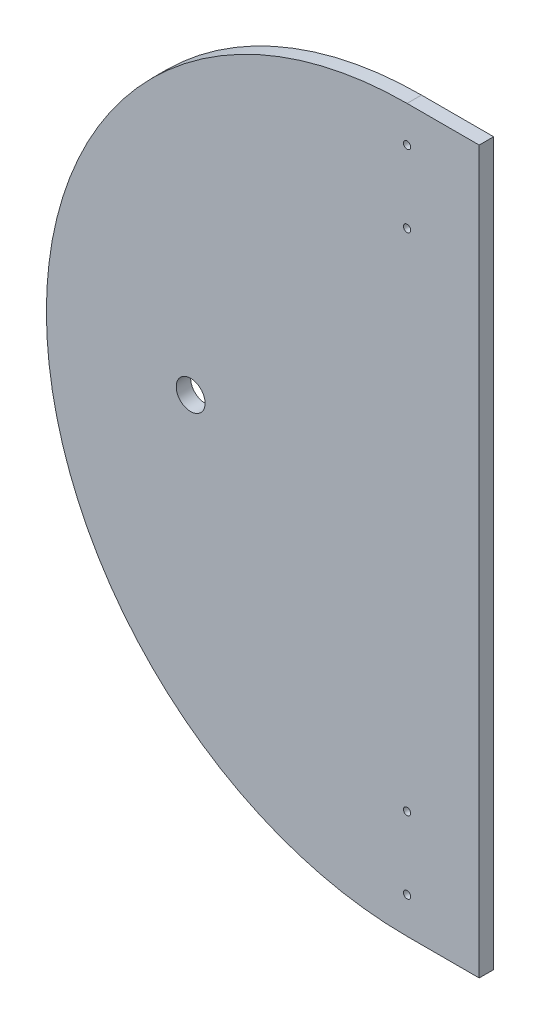
ISO-10303-21;
HEADER;
FILE_DESCRIPTION(('STEP AP214'),'2;1');
FILE_NAME('part.step','',(''),(''),'','','');
FILE_SCHEMA(('AUTOMOTIVE_DESIGN { 1 0 10303 214 1 1 1 1 }'));
ENDSEC;
DATA;
#1=APPLICATION_CONTEXT('core data for automotive mechanical design processes');
#2=APPLICATION_PROTOCOL_DEFINITION('international standard','automotive_design',2000,#1);
#3=PRODUCT_CONTEXT('',#1,'mechanical');
#4=PRODUCT('Part','Part','',(#3));
#5=PRODUCT_RELATED_PRODUCT_CATEGORY('part','',(#4));
#6=PRODUCT_DEFINITION_FORMATION('','',#4);
#7=PRODUCT_DEFINITION_CONTEXT('part definition',#1,'design');
#8=PRODUCT_DEFINITION('design','',#6,#7);
#9=PRODUCT_DEFINITION_SHAPE('','',#8);
#10=(LENGTH_UNIT() NAMED_UNIT(*) SI_UNIT(.MILLI.,.METRE.));
#11=(NAMED_UNIT(*) PLANE_ANGLE_UNIT() SI_UNIT($,.RADIAN.));
#12=(NAMED_UNIT(*) SI_UNIT($,.STERADIAN.) SOLID_ANGLE_UNIT());
#13=UNCERTAINTY_MEASURE_WITH_UNIT(LENGTH_MEASURE(1.E-05),#10,'distance_accuracy_value','');
#14=(GEOMETRIC_REPRESENTATION_CONTEXT(3) GLOBAL_UNCERTAINTY_ASSIGNED_CONTEXT((#13)) GLOBAL_UNIT_ASSIGNED_CONTEXT((#10,
#11,#12)) REPRESENTATION_CONTEXT('',''));
#15=CARTESIAN_POINT('',(0.,0.,0.));
#16=DIRECTION('',(0.,0.,1.));
#17=DIRECTION('',(1.,0.,0.));
#18=AXIS2_PLACEMENT_3D('',#15,#16,#17);
#19=CARTESIAN_POINT('',(0.,0.,5.));
#20=DIRECTION('',(0.,0.,1.));
#21=DIRECTION('',(1.,0.,0.));
#22=AXIS2_PLACEMENT_3D('',#19,#20,#21);
#23=PLANE('',#22);
#24=CARTESIAN_POINT('',(0.,-112.5,5.));
#25=DIRECTION('',(0.,0.,1.));
#26=DIRECTION('',(-1.,0.,0.));
#27=AXIS2_PLACEMENT_3D('',#24,#25,#26);
#28=CIRCLE('',#27,1.25);
#29=CARTESIAN_POINT('',(-1.25,-112.5,5.));
#30=VERTEX_POINT('',#29);
#31=EDGE_CURVE('E135',#30,#30,#28,.T.);
#32=ORIENTED_EDGE('',*,*,#31,.F.);
#33=EDGE_LOOP('',(#32));
#34=FACE_BOUND('',#33,.T.);
#35=CARTESIAN_POINT('',(0.,87.5,5.));
#36=DIRECTION('',(0.,0.,1.));
#37=DIRECTION('',(1.,0.,0.));
#38=AXIS2_PLACEMENT_3D('',#35,#36,#37);
#39=CIRCLE('',#38,1.25);
#40=CARTESIAN_POINT('',(1.25,87.5,5.));
#41=VERTEX_POINT('',#40);
#42=EDGE_CURVE('E123',#41,#41,#39,.T.);
#43=ORIENTED_EDGE('',*,*,#42,.F.);
#44=EDGE_LOOP('',(#43));
#45=FACE_BOUND('',#44,.T.);
#46=DIRECTION('',(0.,1.,0.));
#47=VECTOR('',#46,1.);
#48=CARTESIAN_POINT('',(25.,125.,5.));
#49=LINE('',#48,#47);
#50=CARTESIAN_POINT('',(25.,-125.,5.));
#51=VERTEX_POINT('',#50);
#52=CARTESIAN_POINT('',(25.,125.,5.));
#53=VERTEX_POINT('',#52);
#54=EDGE_CURVE('E93',#51,#53,#49,.T.);
#55=ORIENTED_EDGE('',*,*,#54,.T.);
#56=DIRECTION('',(-1.,0.,0.));
#57=VECTOR('',#56,1.);
#58=CARTESIAN_POINT('',(0.,125.,5.));
#59=LINE('',#58,#57);
#60=CARTESIAN_POINT('',(0.,125.,5.));
#61=VERTEX_POINT('',#60);
#62=EDGE_CURVE('E88',#53,#61,#59,.T.);
#63=ORIENTED_EDGE('',*,*,#62,.T.);
#64=CARTESIAN_POINT('',(0.,0.,5.));
#65=DIRECTION('',(0.,0.,1.));
#66=DIRECTION('',(1.,0.,0.));
#67=AXIS2_PLACEMENT_3D('',#64,#65,#66);
#68=CIRCLE('',#67,125.);
#69=CARTESIAN_POINT('',(0.,-125.,5.));
#70=VERTEX_POINT('',#69);
#71=EDGE_CURVE('E91',#61,#70,#68,.T.);
#72=ORIENTED_EDGE('',*,*,#71,.T.);
#73=DIRECTION('',(1.,0.,0.));
#74=VECTOR('',#73,1.);
#75=CARTESIAN_POINT('',(25.,-125.,5.));
#76=LINE('',#75,#74);
#77=EDGE_CURVE('E58',#70,#51,#76,.T.);
#78=ORIENTED_EDGE('',*,*,#77,.T.);
#79=EDGE_LOOP('',(#55,#63,#72,#78));
#80=FACE_BOUND('',#79,.T.);
#81=CARTESIAN_POINT('',(0.,112.5,5.));
#82=DIRECTION('',(0.,0.,1.));
#83=DIRECTION('',(1.,0.,0.));
#84=AXIS2_PLACEMENT_3D('',#81,#82,#83);
#85=CIRCLE('',#84,1.25);
#86=CARTESIAN_POINT('',(1.25,112.5,5.));
#87=VERTEX_POINT('',#86);
#88=EDGE_CURVE('E108',#87,#87,#85,.T.);
#89=ORIENTED_EDGE('',*,*,#88,.F.);
#90=EDGE_LOOP('',(#89));
#91=FACE_BOUND('',#90,.T.);
#92=CARTESIAN_POINT('',(0.,-87.5,5.));
#93=DIRECTION('',(0.,0.,1.));
#94=DIRECTION('',(-1.,0.,0.));
#95=AXIS2_PLACEMENT_3D('',#92,#93,#94);
#96=CIRCLE('',#95,1.25);
#97=CARTESIAN_POINT('',(-1.25,-87.5,5.));
#98=VERTEX_POINT('',#97);
#99=EDGE_CURVE('E129',#98,#98,#96,.T.);
#100=ORIENTED_EDGE('',*,*,#99,.F.);
#101=EDGE_LOOP('',(#100));
#102=FACE_BOUND('',#101,.T.);
#103=CARTESIAN_POINT('',(-75.,0.,5.));
#104=DIRECTION('',(0.,0.,1.));
#105=DIRECTION('',(1.,0.,0.));
#106=AXIS2_PLACEMENT_3D('',#103,#104,#105);
#107=CIRCLE('',#106,5.);
#108=CARTESIAN_POINT('',(-70.,0.,5.));
#109=VERTEX_POINT('',#108);
#110=EDGE_CURVE('E141',#109,#109,#107,.T.);
#111=ORIENTED_EDGE('',*,*,#110,.F.);
#112=EDGE_LOOP('',(#111));
#113=FACE_BOUND('',#112,.T.);
#114=ADVANCED_FACE('F41',(#34,#45,#80,#91,#102,#113),#23,.T.);
#115=CARTESIAN_POINT('',(0.,0.,0.));
#116=DIRECTION('',(0.,0.,1.));
#117=DIRECTION('',(1.,0.,0.));
#118=AXIS2_PLACEMENT_3D('',#115,#116,#117);
#119=PLANE('',#118);
#120=DIRECTION('',(0.,1.,0.));
#121=VECTOR('',#120,1.);
#122=CARTESIAN_POINT('',(25.,125.,0.));
#123=LINE('',#122,#121);
#124=CARTESIAN_POINT('',(25.,-125.,0.));
#125=VERTEX_POINT('',#124);
#126=CARTESIAN_POINT('',(25.,125.,0.));
#127=VERTEX_POINT('',#126);
#128=EDGE_CURVE('E105',#125,#127,#123,.T.);
#129=ORIENTED_EDGE('',*,*,#128,.F.);
#130=DIRECTION('',(1.,0.,0.));
#131=VECTOR('',#130,1.);
#132=CARTESIAN_POINT('',(25.,-125.,0.));
#133=LINE('',#132,#131);
#134=CARTESIAN_POINT('',(0.,-125.,0.));
#135=VERTEX_POINT('',#134);
#136=EDGE_CURVE('E81',#135,#125,#133,.T.);
#137=ORIENTED_EDGE('',*,*,#136,.F.);
#138=CARTESIAN_POINT('',(0.,0.,0.));
#139=DIRECTION('',(0.,0.,1.));
#140=DIRECTION('',(1.,0.,0.));
#141=AXIS2_PLACEMENT_3D('',#138,#139,#140);
#142=CIRCLE('',#141,125.);
#143=CARTESIAN_POINT('',(0.,125.,0.));
#144=VERTEX_POINT('',#143);
#145=EDGE_CURVE('E75',#144,#135,#142,.T.);
#146=ORIENTED_EDGE('',*,*,#145,.F.);
#147=DIRECTION('',(-1.,0.,0.));
#148=VECTOR('',#147,1.);
#149=CARTESIAN_POINT('',(0.,125.,0.));
#150=LINE('',#149,#148);
#151=EDGE_CURVE('E97',#127,#144,#150,.T.);
#152=ORIENTED_EDGE('',*,*,#151,.F.);
#153=EDGE_LOOP('',(#129,#137,#146,#152));
#154=FACE_BOUND('',#153,.T.);
#155=CARTESIAN_POINT('',(0.,112.5,0.));
#156=DIRECTION('',(0.,0.,1.));
#157=DIRECTION('',(1.,0.,0.));
#158=AXIS2_PLACEMENT_3D('',#155,#156,#157);
#159=CIRCLE('',#158,1.25);
#160=CARTESIAN_POINT('',(1.25,112.5,0.));
#161=VERTEX_POINT('',#160);
#162=EDGE_CURVE('E120',#161,#161,#159,.T.);
#163=ORIENTED_EDGE('',*,*,#162,.T.);
#164=EDGE_LOOP('',(#163));
#165=FACE_BOUND('',#164,.T.);
#166=CARTESIAN_POINT('',(0.,87.5,0.));
#167=DIRECTION('',(0.,0.,1.));
#168=DIRECTION('',(1.,0.,0.));
#169=AXIS2_PLACEMENT_3D('',#166,#167,#168);
#170=CIRCLE('',#169,1.25);
#171=CARTESIAN_POINT('',(1.25,87.5,0.));
#172=VERTEX_POINT('',#171);
#173=EDGE_CURVE('E126',#172,#172,#170,.T.);
#174=ORIENTED_EDGE('',*,*,#173,.T.);
#175=EDGE_LOOP('',(#174));
#176=FACE_BOUND('',#175,.T.);
#177=CARTESIAN_POINT('',(0.,-87.5,0.));
#178=DIRECTION('',(0.,0.,1.));
#179=DIRECTION('',(-1.,0.,0.));
#180=AXIS2_PLACEMENT_3D('',#177,#178,#179);
#181=CIRCLE('',#180,1.25);
#182=CARTESIAN_POINT('',(-1.25,-87.5,0.));
#183=VERTEX_POINT('',#182);
#184=EDGE_CURVE('E132',#183,#183,#181,.T.);
#185=ORIENTED_EDGE('',*,*,#184,.T.);
#186=EDGE_LOOP('',(#185));
#187=FACE_BOUND('',#186,.T.);
#188=CARTESIAN_POINT('',(0.,-112.5,0.));
#189=DIRECTION('',(0.,0.,1.));
#190=DIRECTION('',(-1.,0.,0.));
#191=AXIS2_PLACEMENT_3D('',#188,#189,#190);
#192=CIRCLE('',#191,1.25);
#193=CARTESIAN_POINT('',(-1.25,-112.5,0.));
#194=VERTEX_POINT('',#193);
#195=EDGE_CURVE('E138',#194,#194,#192,.T.);
#196=ORIENTED_EDGE('',*,*,#195,.T.);
#197=EDGE_LOOP('',(#196));
#198=FACE_BOUND('',#197,.T.);
#199=CARTESIAN_POINT('',(-75.,0.,0.));
#200=DIRECTION('',(0.,0.,1.));
#201=DIRECTION('',(1.,0.,0.));
#202=AXIS2_PLACEMENT_3D('',#199,#200,#201);
#203=CIRCLE('',#202,5.);
#204=CARTESIAN_POINT('',(-70.,0.,0.));
#205=VERTEX_POINT('',#204);
#206=EDGE_CURVE('E144',#205,#205,#203,.T.);
#207=ORIENTED_EDGE('',*,*,#206,.T.);
#208=EDGE_LOOP('',(#207));
#209=FACE_BOUND('',#208,.T.);
#210=ADVANCED_FACE('F116',(#154,#165,#176,#187,#198,#209),#119,.F.);
#211=CARTESIAN_POINT('',(25.,125.,5.));
#212=DIRECTION('',(-1.,0.,0.));
#213=DIRECTION('',(0.,0.,1.));
#214=AXIS2_PLACEMENT_3D('',#211,#212,#213);
#215=PLANE('',#214);
#216=ORIENTED_EDGE('',*,*,#128,.T.);
#217=DIRECTION('',(0.,0.,-1.));
#218=VECTOR('',#217,1.);
#219=CARTESIAN_POINT('',(25.,125.,5.));
#220=LINE('',#219,#218);
#221=EDGE_CURVE('E11',#53,#127,#220,.T.);
#222=ORIENTED_EDGE('',*,*,#221,.F.);
#223=ORIENTED_EDGE('',*,*,#54,.F.);
#224=DIRECTION('',(0.,0.,-1.));
#225=VECTOR('',#224,1.);
#226=CARTESIAN_POINT('',(25.,-125.,5.));
#227=LINE('',#226,#225);
#228=EDGE_CURVE('E101',#51,#125,#227,.T.);
#229=ORIENTED_EDGE('',*,*,#228,.T.);
#230=EDGE_LOOP('',(#216,#222,#223,#229));
#231=FACE_BOUND('',#230,.T.);
#232=ADVANCED_FACE('F43',(#231),#215,.F.);
#233=CARTESIAN_POINT('',(0.,125.,5.));
#234=DIRECTION('',(0.,-1.,0.));
#235=DIRECTION('',(0.,0.,-1.));
#236=AXIS2_PLACEMENT_3D('',#233,#234,#235);
#237=PLANE('',#236);
#238=ORIENTED_EDGE('',*,*,#151,.T.);
#239=DIRECTION('',(0.,0.,-1.));
#240=VECTOR('',#239,1.);
#241=CARTESIAN_POINT('',(0.,125.,5.));
#242=LINE('',#241,#240);
#243=EDGE_CURVE('E50',#61,#144,#242,.T.);
#244=ORIENTED_EDGE('',*,*,#243,.F.);
#245=ORIENTED_EDGE('',*,*,#62,.F.);
#246=ORIENTED_EDGE('',*,*,#221,.T.);
#247=EDGE_LOOP('',(#238,#244,#245,#246));
#248=FACE_BOUND('',#247,.T.);
#249=ADVANCED_FACE('F96',(#248),#237,.F.);
#250=CARTESIAN_POINT('',(0.,0.,5.));
#251=DIRECTION('',(0.,0.,-1.));
#252=DIRECTION('',(-1.,0.,0.));
#253=AXIS2_PLACEMENT_3D('',#250,#251,#252);
#254=CYLINDRICAL_SURFACE('',#253,125.);
#255=ORIENTED_EDGE('',*,*,#145,.T.);
#256=DIRECTION('',(0.,0.,-1.));
#257=VECTOR('',#256,1.);
#258=CARTESIAN_POINT('',(0.,-125.,5.));
#259=LINE('',#258,#257);
#260=EDGE_CURVE('E98',#70,#135,#259,.T.);
#261=ORIENTED_EDGE('',*,*,#260,.F.);
#262=ORIENTED_EDGE('',*,*,#71,.F.);
#263=ORIENTED_EDGE('',*,*,#243,.T.);
#264=EDGE_LOOP('',(#255,#261,#262,#263));
#265=FACE_BOUND('',#264,.T.);
#266=ADVANCED_FACE('F99',(#265),#254,.T.);
#267=CARTESIAN_POINT('',(25.,-125.,5.));
#268=DIRECTION('',(0.,1.,0.));
#269=DIRECTION('',(0.,0.,1.));
#270=AXIS2_PLACEMENT_3D('',#267,#268,#269);
#271=PLANE('',#270);
#272=ORIENTED_EDGE('',*,*,#136,.T.);
#273=ORIENTED_EDGE('',*,*,#228,.F.);
#274=ORIENTED_EDGE('',*,*,#77,.F.);
#275=ORIENTED_EDGE('',*,*,#260,.T.);
#276=EDGE_LOOP('',(#272,#273,#274,#275));
#277=FACE_BOUND('',#276,.T.);
#278=ADVANCED_FACE('F113',(#277),#271,.F.);
#279=CARTESIAN_POINT('',(0.,112.5,5.));
#280=DIRECTION('',(0.,0.,-1.));
#281=DIRECTION('',(-1.,0.,0.));
#282=AXIS2_PLACEMENT_3D('',#279,#280,#281);
#283=CYLINDRICAL_SURFACE('',#282,1.25);
#284=ORIENTED_EDGE('',*,*,#88,.T.);
#285=EDGE_LOOP('',(#284));
#286=FACE_BOUND('',#285,.T.);
#287=ORIENTED_EDGE('',*,*,#162,.F.);
#288=EDGE_LOOP('',(#287));
#289=FACE_BOUND('',#288,.T.);
#290=ADVANCED_FACE('F163',(#286,#289),#283,.F.);
#291=CARTESIAN_POINT('',(0.,87.5,5.));
#292=DIRECTION('',(0.,0.,-1.));
#293=DIRECTION('',(-1.,0.,0.));
#294=AXIS2_PLACEMENT_3D('',#291,#292,#293);
#295=CYLINDRICAL_SURFACE('',#294,1.25);
#296=ORIENTED_EDGE('',*,*,#42,.T.);
#297=EDGE_LOOP('',(#296));
#298=FACE_BOUND('',#297,.T.);
#299=ORIENTED_EDGE('',*,*,#173,.F.);
#300=EDGE_LOOP('',(#299));
#301=FACE_BOUND('',#300,.T.);
#302=ADVANCED_FACE('F231',(#298,#301),#295,.F.);
#303=CARTESIAN_POINT('',(0.,-87.5,5.));
#304=DIRECTION('',(0.,0.,-1.));
#305=DIRECTION('',(-1.,0.,0.));
#306=AXIS2_PLACEMENT_3D('',#303,#304,#305);
#307=CYLINDRICAL_SURFACE('',#306,1.25);
#308=ORIENTED_EDGE('',*,*,#99,.T.);
#309=EDGE_LOOP('',(#308));
#310=FACE_BOUND('',#309,.T.);
#311=ORIENTED_EDGE('',*,*,#184,.F.);
#312=EDGE_LOOP('',(#311));
#313=FACE_BOUND('',#312,.T.);
#314=ADVANCED_FACE('F242',(#310,#313),#307,.F.);
#315=CARTESIAN_POINT('',(0.,-112.5,5.));
#316=DIRECTION('',(0.,0.,-1.));
#317=DIRECTION('',(-1.,0.,0.));
#318=AXIS2_PLACEMENT_3D('',#315,#316,#317);
#319=CYLINDRICAL_SURFACE('',#318,1.25);
#320=ORIENTED_EDGE('',*,*,#31,.T.);
#321=EDGE_LOOP('',(#320));
#322=FACE_BOUND('',#321,.T.);
#323=ORIENTED_EDGE('',*,*,#195,.F.);
#324=EDGE_LOOP('',(#323));
#325=FACE_BOUND('',#324,.T.);
#326=ADVANCED_FACE('F253',(#322,#325),#319,.F.);
#327=CARTESIAN_POINT('',(-75.,0.,5.));
#328=DIRECTION('',(0.,0.,-1.));
#329=DIRECTION('',(-1.,0.,0.));
#330=AXIS2_PLACEMENT_3D('',#327,#328,#329);
#331=CYLINDRICAL_SURFACE('',#330,5.);
#332=ORIENTED_EDGE('',*,*,#110,.T.);
#333=EDGE_LOOP('',(#332));
#334=FACE_BOUND('',#333,.T.);
#335=ORIENTED_EDGE('',*,*,#206,.F.);
#336=EDGE_LOOP('',(#335));
#337=FACE_BOUND('',#336,.T.);
#338=ADVANCED_FACE('F150',(#334,#337),#331,.F.);
#339=CLOSED_SHELL('',(#114,#210,#232,#249,#266,#278,#290,#302,#314,#326,#338));
#340=MANIFOLD_SOLID_BREP('B2',#339);
#341=ADVANCED_BREP_SHAPE_REPRESENTATION('',(#18,#340),#14);
#342=SHAPE_DEFINITION_REPRESENTATION(#9,#341);
ENDSEC;
END-ISO-10303-21;
